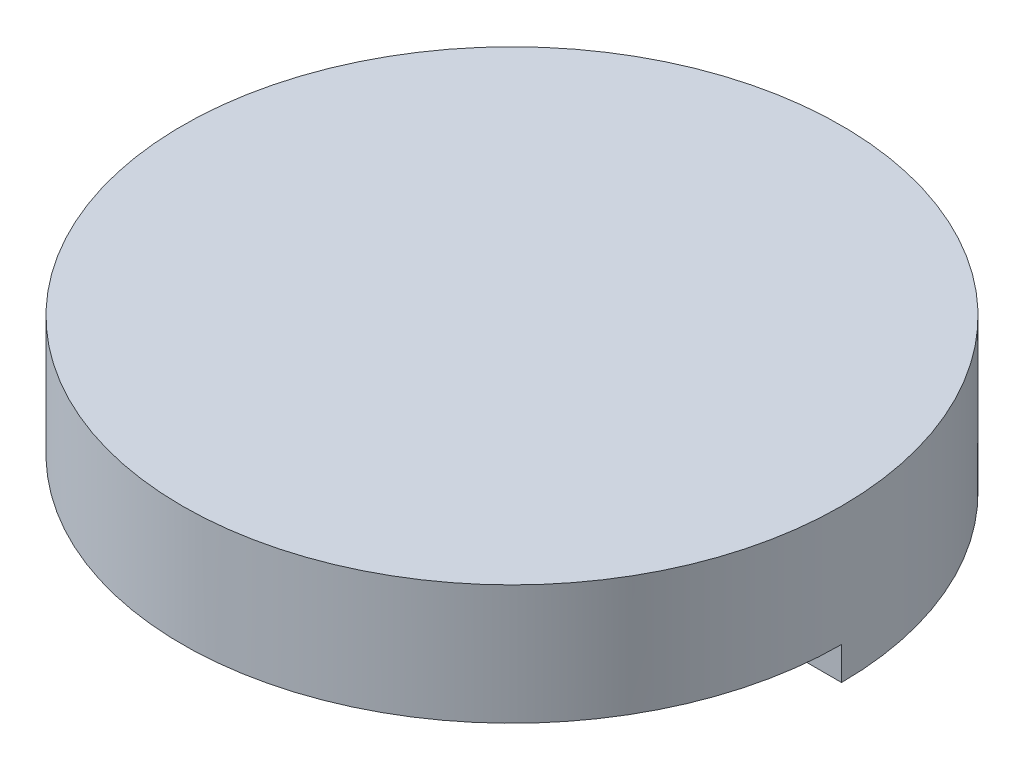
ISO-10303-21;
HEADER;
FILE_DESCRIPTION(('STEP AP214'),'2;1');
FILE_NAME('part.step','',(''),(''),'','','');
FILE_SCHEMA(('AUTOMOTIVE_DESIGN { 1 0 10303 214 1 1 1 1 }'));
ENDSEC;
DATA;
#1=APPLICATION_CONTEXT('core data for automotive mechanical design processes');
#2=APPLICATION_PROTOCOL_DEFINITION('international standard','automotive_design',2000,#1);
#3=PRODUCT_CONTEXT('',#1,'mechanical');
#4=PRODUCT('Part','Part','',(#3));
#5=PRODUCT_RELATED_PRODUCT_CATEGORY('part','',(#4));
#6=PRODUCT_DEFINITION_FORMATION('','',#4);
#7=PRODUCT_DEFINITION_CONTEXT('part definition',#1,'design');
#8=PRODUCT_DEFINITION('design','',#6,#7);
#9=PRODUCT_DEFINITION_SHAPE('','',#8);
#10=(LENGTH_UNIT() NAMED_UNIT(*) SI_UNIT(.MILLI.,.METRE.));
#11=(NAMED_UNIT(*) PLANE_ANGLE_UNIT() SI_UNIT($,.RADIAN.));
#12=(NAMED_UNIT(*) SI_UNIT($,.STERADIAN.) SOLID_ANGLE_UNIT());
#13=UNCERTAINTY_MEASURE_WITH_UNIT(LENGTH_MEASURE(1.E-05),#10,'distance_accuracy_value','');
#14=(GEOMETRIC_REPRESENTATION_CONTEXT(3) GLOBAL_UNCERTAINTY_ASSIGNED_CONTEXT((#13)) GLOBAL_UNIT_ASSIGNED_CONTEXT((#10,
#11,#12)) REPRESENTATION_CONTEXT('',''));
#15=CARTESIAN_POINT('',(0.,0.,0.));
#16=DIRECTION('',(0.,0.,1.));
#17=DIRECTION('',(1.,0.,0.));
#18=AXIS2_PLACEMENT_3D('',#15,#16,#17);
#19=CARTESIAN_POINT('',(0.,4.,0.));
#20=DIRECTION('',(0.,-1.,0.));
#21=DIRECTION('',(0.,0.,-1.));
#22=AXIS2_PLACEMENT_3D('',#19,#20,#21);
#23=CYLINDRICAL_SURFACE('',#22,11.);
#24=CARTESIAN_POINT('',(0.,4.,0.));
#25=DIRECTION('',(0.,1.,0.));
#26=DIRECTION('',(0.,0.,1.));
#27=AXIS2_PLACEMENT_3D('',#24,#25,#26);
#28=CIRCLE('',#27,11.);
#29=CARTESIAN_POINT('',(0.,4.,11.));
#30=VERTEX_POINT('',#29);
#31=EDGE_CURVE('E11',#30,#30,#28,.T.);
#32=ORIENTED_EDGE('',*,*,#31,.F.);
#33=EDGE_LOOP('',(#32));
#34=FACE_BOUND('',#33,.T.);
#35=CARTESIAN_POINT('',(0.,0.,0.));
#36=DIRECTION('',(0.,1.,0.));
#37=DIRECTION('',(0.,0.,1.));
#38=AXIS2_PLACEMENT_3D('',#35,#36,#37);
#39=CIRCLE('',#38,11.);
#40=CARTESIAN_POINT('',(-11.,0.,0.));
#41=VERTEX_POINT('',#40);
#42=CARTESIAN_POINT('',(11.,0.,0.));
#43=VERTEX_POINT('',#42);
#44=EDGE_CURVE('E42',#41,#43,#39,.T.);
#45=ORIENTED_EDGE('',*,*,#44,.T.);
#46=DIRECTION('',(0.,1.,0.));
#47=VECTOR('',#46,1.);
#48=CARTESIAN_POINT('',(11.,-0.6,0.));
#49=LINE('',#48,#47);
#50=CARTESIAN_POINT('',(11.,-1.1,0.));
#51=VERTEX_POINT('',#50);
#52=EDGE_CURVE('E54',#51,#43,#49,.T.);
#53=ORIENTED_EDGE('',*,*,#52,.F.);
#54=CARTESIAN_POINT('',(0.,-1.1,0.));
#55=DIRECTION('',(0.,-1.,0.));
#56=DIRECTION('',(0.,0.,-1.));
#57=AXIS2_PLACEMENT_3D('',#54,#55,#56);
#58=CIRCLE('',#57,11.);
#59=CARTESIAN_POINT('',(-11.,-1.1,0.));
#60=VERTEX_POINT('',#59);
#61=EDGE_CURVE('E151',#60,#51,#58,.T.);
#62=ORIENTED_EDGE('',*,*,#61,.F.);
#63=DIRECTION('',(0.,1.,0.));
#64=VECTOR('',#63,1.);
#65=CARTESIAN_POINT('',(-11.,-0.6,0.));
#66=LINE('',#65,#64);
#67=EDGE_CURVE('E93',#60,#41,#66,.T.);
#68=ORIENTED_EDGE('',*,*,#67,.T.);
#69=EDGE_LOOP('',(#45,#53,#62,#68));
#70=FACE_BOUND('',#69,.T.);
#71=ADVANCED_FACE('F39',(#34,#70),#23,.T.);
#72=CARTESIAN_POINT('',(0.,4.,0.));
#73=DIRECTION('',(0.,1.,0.));
#74=DIRECTION('',(0.,0.,1.));
#75=AXIS2_PLACEMENT_3D('',#72,#73,#74);
#76=PLANE('',#75);
#77=ORIENTED_EDGE('',*,*,#31,.T.);
#78=EDGE_LOOP('',(#77));
#79=FACE_BOUND('',#78,.T.);
#80=ADVANCED_FACE('F172',(#79),#76,.T.);
#81=CARTESIAN_POINT('',(0.,0.,0.));
#82=DIRECTION('',(0.,1.,0.));
#83=DIRECTION('',(0.,0.,1.));
#84=AXIS2_PLACEMENT_3D('',#81,#82,#83);
#85=PLANE('',#84);
#86=ORIENTED_EDGE('',*,*,#44,.F.);
#87=DIRECTION('',(1.,0.,0.));
#88=VECTOR('',#87,1.);
#89=CARTESIAN_POINT('',(-10.,0.,0.));
#90=LINE('',#89,#88);
#91=CARTESIAN_POINT('',(-10.,0.,0.));
#92=VERTEX_POINT('',#91);
#93=EDGE_CURVE('E84',#41,#92,#90,.T.);
#94=ORIENTED_EDGE('',*,*,#93,.T.);
#95=CARTESIAN_POINT('',(0.,0.,0.));
#96=DIRECTION('',(0.,-1.,0.));
#97=DIRECTION('',(0.,0.,-1.));
#98=AXIS2_PLACEMENT_3D('',#95,#96,#97);
#99=CIRCLE('',#98,10.);
#100=CARTESIAN_POINT('',(10.,0.,0.));
#101=VERTEX_POINT('',#100);
#102=EDGE_CURVE('E96',#92,#101,#99,.T.);
#103=ORIENTED_EDGE('',*,*,#102,.T.);
#104=DIRECTION('',(1.,0.,0.));
#105=VECTOR('',#104,1.);
#106=CARTESIAN_POINT('',(10.,0.,0.));
#107=LINE('',#106,#105);
#108=EDGE_CURVE('E100',#101,#43,#107,.T.);
#109=ORIENTED_EDGE('',*,*,#108,.T.);
#110=EDGE_LOOP('',(#86,#94,#103,#109));
#111=FACE_BOUND('',#110,.T.);
#112=ADVANCED_FACE('F102',(#111),#85,.F.);
#113=CARTESIAN_POINT('',(10.,-0.6,0.));
#114=DIRECTION('',(0.,0.,1.));
#115=DIRECTION('',(1.,0.,0.));
#116=AXIS2_PLACEMENT_3D('',#113,#114,#115);
#117=PLANE('',#116);
#118=ORIENTED_EDGE('',*,*,#108,.F.);
#119=DIRECTION('',(0.,1.,0.));
#120=VECTOR('',#119,1.);
#121=CARTESIAN_POINT('',(10.,-0.6,0.));
#122=LINE('',#121,#120);
#123=CARTESIAN_POINT('',(10.,-0.6,0.));
#124=VERTEX_POINT('',#123);
#125=EDGE_CURVE('E92',#124,#101,#122,.T.);
#126=ORIENTED_EDGE('',*,*,#125,.F.);
#127=DIRECTION('',(-1.,0.,0.));
#128=VECTOR('',#127,1.);
#129=CARTESIAN_POINT('',(8.5,-0.6,0.));
#130=LINE('',#129,#128);
#131=CARTESIAN_POINT('',(8.5,-0.6,0.));
#132=VERTEX_POINT('',#131);
#133=EDGE_CURVE('E63',#124,#132,#130,.T.);
#134=ORIENTED_EDGE('',*,*,#133,.T.);
#135=DIRECTION('',(0.,1.,0.));
#136=VECTOR('',#135,1.);
#137=CARTESIAN_POINT('',(8.5,-1.1,0.));
#138=LINE('',#137,#136);
#139=CARTESIAN_POINT('',(8.5,-1.1,0.));
#140=VERTEX_POINT('',#139);
#141=EDGE_CURVE('E105',#140,#132,#138,.T.);
#142=ORIENTED_EDGE('',*,*,#141,.F.);
#143=DIRECTION('',(-1.,0.,0.));
#144=VECTOR('',#143,1.);
#145=CARTESIAN_POINT('',(8.5,-1.1,0.));
#146=LINE('',#145,#144);
#147=EDGE_CURVE('E146',#51,#140,#146,.T.);
#148=ORIENTED_EDGE('',*,*,#147,.F.);
#149=ORIENTED_EDGE('',*,*,#52,.T.);
#150=EDGE_LOOP('',(#118,#126,#134,#142,#148,#149));
#151=FACE_BOUND('',#150,.T.);
#152=ADVANCED_FACE('F154',(#151),#117,.T.);
#153=CARTESIAN_POINT('',(0.,-0.6,0.));
#154=DIRECTION('',(0.,1.,0.));
#155=DIRECTION('',(0.,0.,1.));
#156=AXIS2_PLACEMENT_3D('',#153,#154,#155);
#157=CYLINDRICAL_SURFACE('',#156,10.);
#158=ORIENTED_EDGE('',*,*,#102,.F.);
#159=DIRECTION('',(0.,1.,0.));
#160=VECTOR('',#159,1.);
#161=CARTESIAN_POINT('',(-10.,-0.6,0.));
#162=LINE('',#161,#160);
#163=CARTESIAN_POINT('',(-10.,-0.6,0.));
#164=VERTEX_POINT('',#163);
#165=EDGE_CURVE('E79',#164,#92,#162,.T.);
#166=ORIENTED_EDGE('',*,*,#165,.F.);
#167=CARTESIAN_POINT('',(0.,-0.6,0.));
#168=DIRECTION('',(0.,-1.,0.));
#169=DIRECTION('',(0.,0.,-1.));
#170=AXIS2_PLACEMENT_3D('',#167,#168,#169);
#171=CIRCLE('',#170,10.);
#172=EDGE_CURVE('E112',#164,#124,#171,.T.);
#173=ORIENTED_EDGE('',*,*,#172,.T.);
#174=ORIENTED_EDGE('',*,*,#125,.T.);
#175=EDGE_LOOP('',(#158,#166,#173,#174));
#176=FACE_BOUND('',#175,.T.);
#177=ADVANCED_FACE('F97',(#176),#157,.F.);
#178=CARTESIAN_POINT('',(-10.,-0.6,0.));
#179=DIRECTION('',(0.,0.,1.));
#180=DIRECTION('',(1.,0.,0.));
#181=AXIS2_PLACEMENT_3D('',#178,#179,#180);
#182=PLANE('',#181);
#183=ORIENTED_EDGE('',*,*,#93,.F.);
#184=ORIENTED_EDGE('',*,*,#67,.F.);
#185=DIRECTION('',(-1.,0.,0.));
#186=VECTOR('',#185,1.);
#187=CARTESIAN_POINT('',(-11.,-1.1,0.));
#188=LINE('',#187,#186);
#189=CARTESIAN_POINT('',(-8.5,-1.1,0.));
#190=VERTEX_POINT('',#189);
#191=EDGE_CURVE('E157',#190,#60,#188,.T.);
#192=ORIENTED_EDGE('',*,*,#191,.F.);
#193=DIRECTION('',(0.,1.,0.));
#194=VECTOR('',#193,1.);
#195=CARTESIAN_POINT('',(-8.5,-1.1,0.));
#196=LINE('',#195,#194);
#197=CARTESIAN_POINT('',(-8.5,-0.6,0.));
#198=VERTEX_POINT('',#197);
#199=EDGE_CURVE('E109',#190,#198,#196,.T.);
#200=ORIENTED_EDGE('',*,*,#199,.T.);
#201=DIRECTION('',(-1.,0.,0.));
#202=VECTOR('',#201,1.);
#203=CARTESIAN_POINT('',(-11.,-0.6,0.));
#204=LINE('',#203,#202);
#205=EDGE_CURVE('E88',#198,#164,#204,.T.);
#206=ORIENTED_EDGE('',*,*,#205,.T.);
#207=ORIENTED_EDGE('',*,*,#165,.T.);
#208=EDGE_LOOP('',(#183,#184,#192,#200,#206,#207));
#209=FACE_BOUND('',#208,.T.);
#210=ADVANCED_FACE('F81',(#209),#182,.T.);
#211=CARTESIAN_POINT('',(0.,-0.6,0.));
#212=DIRECTION('',(0.,-1.,0.));
#213=DIRECTION('',(0.,0.,-1.));
#214=AXIS2_PLACEMENT_3D('',#211,#212,#213);
#215=PLANE('',#214);
#216=ORIENTED_EDGE('',*,*,#172,.F.);
#217=ORIENTED_EDGE('',*,*,#205,.F.);
#218=CARTESIAN_POINT('',(0.,-0.6,0.));
#219=DIRECTION('',(0.,1.,0.));
#220=DIRECTION('',(0.,0.,-1.));
#221=AXIS2_PLACEMENT_3D('',#218,#219,#220);
#222=CIRCLE('',#221,8.5);
#223=EDGE_CURVE('E141',#132,#198,#222,.T.);
#224=ORIENTED_EDGE('',*,*,#223,.F.);
#225=ORIENTED_EDGE('',*,*,#133,.F.);
#226=EDGE_LOOP('',(#216,#217,#224,#225));
#227=FACE_BOUND('',#226,.T.);
#228=ADVANCED_FACE('F124',(#227),#215,.F.);
#229=CARTESIAN_POINT('',(0.,-1.1,0.));
#230=DIRECTION('',(0.,1.,0.));
#231=DIRECTION('',(0.,0.,1.));
#232=AXIS2_PLACEMENT_3D('',#229,#230,#231);
#233=CYLINDRICAL_SURFACE('',#232,8.5);
#234=ORIENTED_EDGE('',*,*,#223,.T.);
#235=ORIENTED_EDGE('',*,*,#199,.F.);
#236=CARTESIAN_POINT('',(0.,-1.1,0.));
#237=DIRECTION('',(0.,1.,0.));
#238=DIRECTION('',(0.,0.,-1.));
#239=AXIS2_PLACEMENT_3D('',#236,#237,#238);
#240=CIRCLE('',#239,8.5);
#241=EDGE_CURVE('E150',#140,#190,#240,.T.);
#242=ORIENTED_EDGE('',*,*,#241,.F.);
#243=ORIENTED_EDGE('',*,*,#141,.T.);
#244=EDGE_LOOP('',(#234,#235,#242,#243));
#245=FACE_BOUND('',#244,.T.);
#246=ADVANCED_FACE('F155',(#245),#233,.F.);
#247=CARTESIAN_POINT('',(0.,-1.1,0.));
#248=DIRECTION('',(0.,-1.,0.));
#249=DIRECTION('',(0.,0.,-1.));
#250=AXIS2_PLACEMENT_3D('',#247,#248,#249);
#251=PLANE('',#250);
#252=ORIENTED_EDGE('',*,*,#61,.T.);
#253=ORIENTED_EDGE('',*,*,#147,.T.);
#254=ORIENTED_EDGE('',*,*,#241,.T.);
#255=ORIENTED_EDGE('',*,*,#191,.T.);
#256=EDGE_LOOP('',(#252,#253,#254,#255));
#257=FACE_BOUND('',#256,.T.);
#258=ADVANCED_FACE('F148',(#257),#251,.T.);
#259=CLOSED_SHELL('',(#71,#80,#112,#152,#177,#210,#228,#246,#258));
#260=MANIFOLD_SOLID_BREP('B2',#259);
#261=ADVANCED_BREP_SHAPE_REPRESENTATION('',(#18,#260),#14);
#262=SHAPE_DEFINITION_REPRESENTATION(#9,#261);
ENDSEC;
END-ISO-10303-21;
